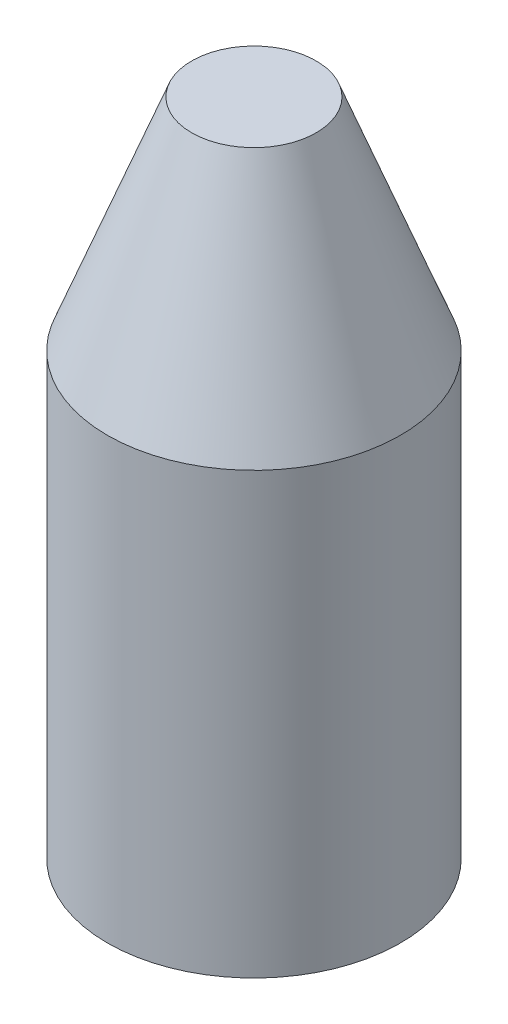
ISO-10303-21;
HEADER;
FILE_DESCRIPTION(('STEP AP214'),'2;1');
FILE_NAME('part.step','',(''),(''),'','','');
FILE_SCHEMA(('AUTOMOTIVE_DESIGN { 1 0 10303 214 1 1 1 1 }'));
ENDSEC;
DATA;
#1=APPLICATION_CONTEXT('core data for automotive mechanical design processes');
#2=APPLICATION_PROTOCOL_DEFINITION('international standard','automotive_design',2000,#1);
#3=PRODUCT_CONTEXT('',#1,'mechanical');
#4=PRODUCT('Part','Part','',(#3));
#5=PRODUCT_RELATED_PRODUCT_CATEGORY('part','',(#4));
#6=PRODUCT_DEFINITION_FORMATION('','',#4);
#7=PRODUCT_DEFINITION_CONTEXT('part definition',#1,'design');
#8=PRODUCT_DEFINITION('design','',#6,#7);
#9=PRODUCT_DEFINITION_SHAPE('','',#8);
#10=(LENGTH_UNIT() NAMED_UNIT(*) SI_UNIT(.MILLI.,.METRE.));
#11=(NAMED_UNIT(*) PLANE_ANGLE_UNIT() SI_UNIT($,.RADIAN.));
#12=(NAMED_UNIT(*) SI_UNIT($,.STERADIAN.) SOLID_ANGLE_UNIT());
#13=UNCERTAINTY_MEASURE_WITH_UNIT(LENGTH_MEASURE(1.E-05),#10,'distance_accuracy_value','');
#14=(GEOMETRIC_REPRESENTATION_CONTEXT(3) GLOBAL_UNCERTAINTY_ASSIGNED_CONTEXT((#13)) GLOBAL_UNIT_ASSIGNED_CONTEXT((#10,
#11,#12)) REPRESENTATION_CONTEXT('',''));
#15=CARTESIAN_POINT('',(0.,0.,0.));
#16=DIRECTION('',(0.,0.,1.));
#17=DIRECTION('',(1.,0.,0.));
#18=AXIS2_PLACEMENT_3D('',#15,#16,#17);
#19=CARTESIAN_POINT('',(0.,22.5,0.));
#20=DIRECTION('',(0.,-1.,0.));
#21=DIRECTION('',(0.,0.,-1.));
#22=AXIS2_PLACEMENT_3D('',#19,#20,#21);
#23=PLANE('',#22);
#24=CARTESIAN_POINT('',(0.,22.5,0.));
#25=DIRECTION('',(0.,1.,0.));
#26=DIRECTION('',(0.,0.,1.));
#27=AXIS2_PLACEMENT_3D('',#24,#25,#26);
#28=CIRCLE('',#27,4.24892703862661);
#29=CARTESIAN_POINT('',(0.,22.5,4.24892703862661));
#30=VERTEX_POINT('',#29);
#31=EDGE_CURVE('E10',#30,#30,#28,.T.);
#32=ORIENTED_EDGE('',*,*,#31,.T.);
#33=EDGE_LOOP('',(#32));
#34=FACE_BOUND('',#33,.T.);
#35=ADVANCED_FACE('F35',(#34),#23,.F.);
#36=CARTESIAN_POINT('',(0.,7.5,0.));
#37=DIRECTION('',(0.,-1.,0.));
#38=DIRECTION('',(0.,0.,-1.));
#39=AXIS2_PLACEMENT_3D('',#36,#37,#38);
#40=CONICAL_SURFACE('',#39,10.,0.366118880723439);
#41=ORIENTED_EDGE('',*,*,#31,.F.);
#42=EDGE_LOOP('',(#41));
#43=FACE_BOUND('',#42,.T.);
#44=CARTESIAN_POINT('',(0.,7.5,0.));
#45=DIRECTION('',(0.,1.,0.));
#46=DIRECTION('',(0.,0.,1.));
#47=AXIS2_PLACEMENT_3D('',#44,#45,#46);
#48=CIRCLE('',#47,10.);
#49=CARTESIAN_POINT('',(0.,7.5,10.));
#50=VERTEX_POINT('',#49);
#51=EDGE_CURVE('E41',#50,#50,#48,.T.);
#52=ORIENTED_EDGE('',*,*,#51,.T.);
#53=EDGE_LOOP('',(#52));
#54=FACE_BOUND('',#53,.T.);
#55=ADVANCED_FACE('F60',(#43,#54),#40,.T.);
#56=CARTESIAN_POINT('',(0.,22.5,0.));
#57=DIRECTION('',(0.,1.,0.));
#58=DIRECTION('',(0.,0.,1.));
#59=AXIS2_PLACEMENT_3D('',#56,#57,#58);
#60=CYLINDRICAL_SURFACE('',#59,10.);
#61=ORIENTED_EDGE('',*,*,#51,.F.);
#62=EDGE_LOOP('',(#61));
#63=FACE_BOUND('',#62,.T.);
#64=CARTESIAN_POINT('',(0.,-22.5,0.));
#65=DIRECTION('',(0.,1.,0.));
#66=DIRECTION('',(0.,0.,1.));
#67=AXIS2_PLACEMENT_3D('',#64,#65,#66);
#68=CIRCLE('',#67,10.);
#69=CARTESIAN_POINT('',(0.,-22.5,10.));
#70=VERTEX_POINT('',#69);
#71=EDGE_CURVE('E45',#70,#70,#68,.T.);
#72=ORIENTED_EDGE('',*,*,#71,.T.);
#73=EDGE_LOOP('',(#72));
#74=FACE_BOUND('',#73,.T.);
#75=ADVANCED_FACE('F52',(#63,#74),#60,.T.);
#76=CARTESIAN_POINT('',(10.,-22.5,0.));
#77=DIRECTION('',(0.,1.,0.));
#78=DIRECTION('',(0.,0.,1.));
#79=AXIS2_PLACEMENT_3D('',#76,#77,#78);
#80=PLANE('',#79);
#81=ORIENTED_EDGE('',*,*,#71,.F.);
#82=EDGE_LOOP('',(#81));
#83=FACE_BOUND('',#82,.T.);
#84=ADVANCED_FACE('F54',(#83),#80,.F.);
#85=CLOSED_SHELL('',(#35,#55,#75,#84));
#86=MANIFOLD_SOLID_BREP('B2',#85);
#87=ADVANCED_BREP_SHAPE_REPRESENTATION('',(#18,#86),#14);
#88=SHAPE_DEFINITION_REPRESENTATION(#9,#87);
ENDSEC;
END-ISO-10303-21;
